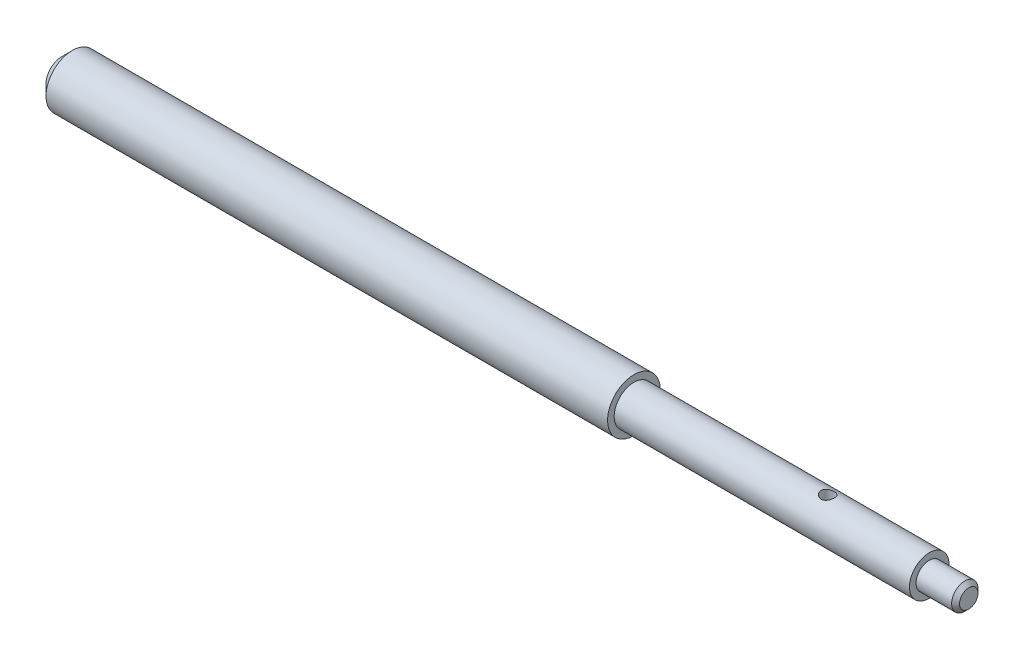
ISO-10303-21;
HEADER;
FILE_DESCRIPTION(('STEP AP214'),'2;1');
FILE_NAME('part.step','',(''),(''),'','','');
FILE_SCHEMA(('AUTOMOTIVE_DESIGN { 1 0 10303 214 1 1 1 1 }'));
ENDSEC;
DATA;
#1=APPLICATION_CONTEXT('core data for automotive mechanical design processes');
#2=APPLICATION_PROTOCOL_DEFINITION('international standard','automotive_design',2000,#1);
#3=PRODUCT_CONTEXT('',#1,'mechanical');
#4=PRODUCT('Part','Part','',(#3));
#5=PRODUCT_RELATED_PRODUCT_CATEGORY('part','',(#4));
#6=PRODUCT_DEFINITION_FORMATION('','',#4);
#7=PRODUCT_DEFINITION_CONTEXT('part definition',#1,'design');
#8=PRODUCT_DEFINITION('design','',#6,#7);
#9=PRODUCT_DEFINITION_SHAPE('','',#8);
#10=(LENGTH_UNIT() NAMED_UNIT(*) SI_UNIT(.MILLI.,.METRE.));
#11=(NAMED_UNIT(*) PLANE_ANGLE_UNIT() SI_UNIT($,.RADIAN.));
#12=(NAMED_UNIT(*) SI_UNIT($,.STERADIAN.) SOLID_ANGLE_UNIT());
#13=UNCERTAINTY_MEASURE_WITH_UNIT(LENGTH_MEASURE(1.E-05),#10,'distance_accuracy_value','');
#14=(GEOMETRIC_REPRESENTATION_CONTEXT(3) GLOBAL_UNCERTAINTY_ASSIGNED_CONTEXT((#13)) GLOBAL_UNIT_ASSIGNED_CONTEXT((#10,
#11,#12)) REPRESENTATION_CONTEXT('',''));
#15=CARTESIAN_POINT('',(0.,0.,0.));
#16=DIRECTION('',(0.,0.,1.));
#17=DIRECTION('',(1.,0.,0.));
#18=AXIS2_PLACEMENT_3D('',#15,#16,#17);
#19=CARTESIAN_POINT('',(303.948321010253,9.92894053429299,0.));
#20=DIRECTION('',(1.,0.,0.));
#21=DIRECTION('',(0.,0.,-1.));
#22=AXIS2_PLACEMENT_3D('',#19,#20,#21);
#23=PLANE('',#22);
#24=CARTESIAN_POINT('',(303.948321010239,7.428940534293,0.));
#25=DIRECTION('',(-1.,0.,0.));
#26=DIRECTION('',(0.,0.,1.));
#27=AXIS2_PLACEMENT_3D('',#24,#25,#26);
#28=CIRCLE('',#27,3.50000000004147);
#29=CARTESIAN_POINT('',(303.948321010239,7.428940534293,3.50000000004147));
#30=VERTEX_POINT('',#29);
#31=EDGE_CURVE('E21',#30,#30,#28,.T.);
#32=ORIENTED_EDGE('',*,*,#31,.F.);
#33=EDGE_LOOP('',(#32));
#34=FACE_BOUND('',#33,.T.);
#35=ADVANCED_FACE('F17',(#34),#23,.T.);
#36=CARTESIAN_POINT('',(302.448321010274,7.428940534293,0.));
#37=DIRECTION('',(-1.,0.,0.));
#38=DIRECTION('',(0.,0.,1.));
#39=AXIS2_PLACEMENT_3D('',#36,#37,#38);
#40=CONICAL_SURFACE('',#39,5.000000000006,0.785398163397448);
#41=CARTESIAN_POINT('',(302.448321010253,7.428940534293,0.));
#42=DIRECTION('',(1.,0.,0.));
#43=DIRECTION('',(0.,1.,0.));
#44=AXIS2_PLACEMENT_3D('',#41,#42,#43);
#45=CIRCLE('',#44,4.99999999999999);
#46=CARTESIAN_POINT('',(302.448321010253,12.428940534293,0.));
#47=VERTEX_POINT('',#46);
#48=EDGE_CURVE('E40',#47,#47,#45,.F.);
#49=ORIENTED_EDGE('',*,*,#48,.F.);
#50=EDGE_LOOP('',(#49));
#51=FACE_BOUND('',#50,.T.);
#52=ORIENTED_EDGE('',*,*,#31,.T.);
#53=EDGE_LOOP('',(#52));
#54=FACE_BOUND('',#53,.T.);
#55=ADVANCED_FACE('F33',(#51,#54),#40,.T.);
#56=CARTESIAN_POINT('',(-12.0516789897351,7.42894053429294,0.));
#57=DIRECTION('',(-1.,0.,0.));
#58=DIRECTION('',(0.,-1.,0.));
#59=AXIS2_PLACEMENT_3D('',#56,#57,#58);
#60=CONICAL_SURFACE('',#59,4.18799999994235,1.02974425867618);
#61=CARTESIAN_POINT('',(-9.53527471727966,7.42894053429294,0.));
#62=VERTEX_POINT('',#61);
#63=VERTEX_LOOP('',#62);
#64=FACE_BOUND('',#63,.T.);
#65=CARTESIAN_POINT('',(-12.0516789897468,7.42894053429294,0.));
#66=DIRECTION('',(-1.,0.,0.));
#67=DIRECTION('',(0.,-1.,0.));
#68=AXIS2_PLACEMENT_3D('',#65,#66,#67);
#69=CIRCLE('',#68,4.188);
#70=CARTESIAN_POINT('',(-12.0516789897468,3.24094053429295,0.));
#71=VERTEX_POINT('',#70);
#72=EDGE_CURVE('E37',#71,#71,#69,.T.);
#73=ORIENTED_EDGE('',*,*,#72,.T.);
#74=EDGE_LOOP('',(#73));
#75=FACE_BOUND('',#74,.T.);
#76=ADVANCED_FACE('F29',(#64,#75),#60,.F.);
#77=CARTESIAN_POINT('',(296.448321010253,7.42894053429299,0.));
#78=DIRECTION('',(1.,0.,0.));
#79=DIRECTION('',(0.,1.,0.));
#80=AXIS2_PLACEMENT_3D('',#77,#78,#79);
#81=CYLINDRICAL_SURFACE('',#80,4.99999999999999);
#82=ORIENTED_EDGE('',*,*,#48,.T.);
#83=EDGE_LOOP('',(#82));
#84=FACE_BOUND('',#83,.T.);
#85=CARTESIAN_POINT('',(288.948321010253,7.42894053429299,0.));
#86=DIRECTION('',(1.,0.,0.));
#87=DIRECTION('',(0.,1.,0.));
#88=AXIS2_PLACEMENT_3D('',#85,#86,#87);
#89=CIRCLE('',#88,4.99999999999999);
#90=CARTESIAN_POINT('',(288.948321010253,12.428940534293,0.));
#91=VERTEX_POINT('',#90);
#92=EDGE_CURVE('E39',#91,#91,#89,.F.);
#93=ORIENTED_EDGE('',*,*,#92,.F.);
#94=EDGE_LOOP('',(#93));
#95=FACE_BOUND('',#94,.T.);
#96=ADVANCED_FACE('F32',(#84,#95),#81,.T.);
#97=CARTESIAN_POINT('',(-26.0516789897468,7.42894053429294,0.));
#98=DIRECTION('',(-1.,0.,0.));
#99=DIRECTION('',(0.,-1.,0.));
#100=AXIS2_PLACEMENT_3D('',#97,#98,#99);
#101=CYLINDRICAL_SURFACE('',#100,4.188);
#102=CARTESIAN_POINT('',(-40.0516789897468,7.42894053429294,0.));
#103=DIRECTION('',(-1.,0.,0.));
#104=DIRECTION('',(0.,-1.,0.));
#105=AXIS2_PLACEMENT_3D('',#102,#103,#104);
#106=CIRCLE('',#105,4.188);
#107=CARTESIAN_POINT('',(-40.0516789897468,3.24094053429294,0.));
#108=VERTEX_POINT('',#107);
#109=EDGE_CURVE('E43',#108,#108,#106,.F.);
#110=ORIENTED_EDGE('',*,*,#109,.F.);
#111=EDGE_LOOP('',(#110));
#112=FACE_BOUND('',#111,.T.);
#113=ORIENTED_EDGE('',*,*,#72,.F.);
#114=EDGE_LOOP('',(#113));
#115=FACE_BOUND('',#114,.T.);
#116=ADVANCED_FACE('F84',(#112,#115),#101,.F.);
#117=CARTESIAN_POINT('',(288.948321010253,13.678940534293,0.));
#118=DIRECTION('',(1.,0.,0.));
#119=DIRECTION('',(0.,0.,-1.));
#120=AXIS2_PLACEMENT_3D('',#117,#118,#119);
#121=PLANE('',#120);
#122=CARTESIAN_POINT('',(288.948321010253,7.42894053429299,0.));
#123=DIRECTION('',(1.,0.,0.));
#124=DIRECTION('',(0.,1.,0.));
#125=AXIS2_PLACEMENT_3D('',#122,#123,#124);
#126=CIRCLE('',#125,7.5);
#127=CARTESIAN_POINT('',(288.948321010253,14.928940534293,0.));
#128=VERTEX_POINT('',#127);
#129=EDGE_CURVE('E61',#128,#128,#126,.F.);
#130=ORIENTED_EDGE('',*,*,#129,.F.);
#131=EDGE_LOOP('',(#130));
#132=FACE_BOUND('',#131,.T.);
#133=ORIENTED_EDGE('',*,*,#92,.T.);
#134=EDGE_LOOP('',(#133));
#135=FACE_BOUND('',#134,.T.);
#136=ADVANCED_FACE('F86',(#132,#135),#121,.T.);
#137=CARTESIAN_POINT('',(250.448321010253,-330.231891542581,0.));
#138=DIRECTION('',(0.,1.,0.));
#139=DIRECTION('',(0.,0.,1.));
#140=AXIS2_PLACEMENT_3D('',#137,#138,#139);
#141=CYLINDRICAL_SURFACE('',#140,2.5);
#142=CARTESIAN_POINT('',(252.948321010253,-0.0710594657070066,0.));
#143=CARTESIAN_POINT('',(252.948315289086,-0.0710553168671624,-0.136314653212454));
#144=CARTESIAN_POINT('',(252.937127317973,-0.0673054235412228,-0.272697015497234));
#145=CARTESIAN_POINT('',(252.892775388844,-0.0526992408798257,-0.541513676754403));
#146=CARTESIAN_POINT('',(252.859592311722,-0.0418367690802491,-0.673944436069899));
#147=CARTESIAN_POINT('',(252.772519291371,-0.0141908427939557,-0.93083838541186));
#148=CARTESIAN_POINT('',(252.718670425221,0.0025808606184202,-1.0553168132522));
#149=CARTESIAN_POINT('',(252.591957658,0.0403323388509107,-1.29345457608578));
#150=CARTESIAN_POINT('',(252.51909274861,0.0613123368005866,-1.40711333693402));
#151=CARTESIAN_POINT('',(252.353757299219,0.106087971569338,-1.62435286768726));
#152=CARTESIAN_POINT('',(252.260744755449,0.12995115727989,-1.72750715170701));
#153=CARTESIAN_POINT('',(252.058905279206,0.177432192263919,-1.9170800866657));
#154=CARTESIAN_POINT('',(251.950074562877,0.201049981383735,-2.00349472175254));
#155=CARTESIAN_POINT('',(251.71585817561,0.246107232723915,-2.15956236853007));
#156=CARTESIAN_POINT('',(251.590086569022,0.267464568412221,-2.22866219130383));
#157=CARTESIAN_POINT('',(251.327880676565,0.304557909711179,-2.34454722267796));
#158=CARTESIAN_POINT('',(251.191449667114,0.320295634421334,-2.39133925694144));
#159=CARTESIAN_POINT('',(250.916637989899,0.343657949839375,-2.45968364452053));
#160=CARTESIAN_POINT('',(250.778478057837,0.351538136224064,-2.48203360995672));
#161=CARTESIAN_POINT('',(250.50016169452,0.359049118644279,-2.50335280844789));
#162=CARTESIAN_POINT('',(250.360005892559,0.358682459754604,-2.5023292548481));
#163=CARTESIAN_POINT('',(250.088479715616,0.349965168186405,-2.47754978711554));
#164=CARTESIAN_POINT('',(249.957000562013,0.341980171664286,-2.45483488748614));
#165=CARTESIAN_POINT('',(249.699837996523,0.319524152884575,-2.38901558266189));
#166=CARTESIAN_POINT('',(249.574155305244,0.305052326576364,-2.34590864981248));
#167=CARTESIAN_POINT('',(249.329785848802,0.270992296947017,-2.2398462476676));
#168=CARTESIAN_POINT('',(249.211244617322,0.251325336049249,-2.17658185417499));
#169=CARTESIAN_POINT('',(248.986138019905,0.209125364104765,-2.03221830577523));
#170=CARTESIAN_POINT('',(248.879575484144,0.186591678413515,-1.95111494942618));
#171=CARTESIAN_POINT('',(248.675609928247,0.139761406617017,-1.76838980557481));
#172=CARTESIAN_POINT('',(248.578972480831,0.11543411332981,-1.66591968733747));
#173=CARTESIAN_POINT('',(248.404019566381,0.0687747460619948,-1.44588748626492));
#174=CARTESIAN_POINT('',(248.325712130403,0.0464435492839721,-1.32831882300372));
#175=CARTESIAN_POINT('',(248.189021881702,0.00599537469104058,-1.07976849629978));
#176=CARTESIAN_POINT('',(248.130859338821,-0.012074364585716,-0.948657728384027));
#177=CARTESIAN_POINT('',(248.037750903227,-0.0415932671800559,-0.677907908939383));
#178=CARTESIAN_POINT('',(248.002757477839,-0.0530559788679125,-0.538286963583211));
#179=CARTESIAN_POINT('',(247.969457131976,-0.0640354472506519,-0.331144714284248));
#180=CARTESIAN_POINT('',(247.961540987829,-0.0666615245410833,-0.265203309002763));
#181=CARTESIAN_POINT('',(247.950971052392,-0.0701748653833046,-0.132852390134966));
#182=CARTESIAN_POINT('',(247.948317276651,-0.0710621237973576,-0.0664428751660984));
#183=CARTESIAN_POINT('',(247.94832866473,-0.0710540161992309,0.136218456610964));
#184=CARTESIAN_POINT('',(247.959506234404,-0.0673081125267976,0.272577131195229));
#185=CARTESIAN_POINT('',(248.003839760976,-0.052708192622139,0.541419482910542));
#186=CARTESIAN_POINT('',(248.037032281082,-0.0418423517082799,0.673896330118084));
#187=CARTESIAN_POINT('',(248.124127154109,-0.0141893886807071,0.930848136584548));
#188=CARTESIAN_POINT('',(248.177982221765,0.00258420668086991,1.05534061399224));
#189=CARTESIAN_POINT('',(248.304698779855,0.0403364545026818,1.29347783804415));
#190=CARTESIAN_POINT('',(248.377557533634,0.0613145013936149,1.40712414339235));
#191=CARTESIAN_POINT('',(248.542875932665,0.106085666564891,1.62434137046777));
#192=CARTESIAN_POINT('',(248.635877389843,0.129946312937663,1.72748595674383));
#193=CARTESIAN_POINT('',(248.837715434827,0.177427348219232,1.9170626035233));
#194=CARTESIAN_POINT('',(248.946559019678,0.201047626005807,2.00348723977977));
#195=CARTESIAN_POINT('',(249.180836469829,0.246118109871319,2.1595993481913));
#196=CARTESIAN_POINT('',(249.306661192686,0.267485078448849,2.22872605232901));
#197=CARTESIAN_POINT('',(249.568903897811,0.304572536494688,2.34459310944108));
#198=CARTESIAN_POINT('',(249.705308454272,0.320300044334159,2.39136131215655));
#199=CARTESIAN_POINT('',(249.943325026568,0.340543637268385,2.45056654982395));
#200=CARTESIAN_POINT('',(250.043304470877,0.346999488540521,2.4690650550467));
#201=CARTESIAN_POINT('',(250.244950364944,0.355665757458104,2.49378342479918));
#202=CARTESIAN_POINT('',(250.346616659674,0.357876563086767,2.50000441145518));
#203=CARTESIAN_POINT('',(250.584398806186,0.357867583724572,2.49999409758682));
#204=CARTESIAN_POINT('',(250.720544728747,0.353897840760277,2.48884364355159));
#205=CARTESIAN_POINT('',(250.98886910805,0.338511194600065,2.44465430727942));
#206=CARTESIAN_POINT('',(251.121043831329,0.327087499548411,2.41159546223126));
#207=CARTESIAN_POINT('',(251.377395710493,0.298233880141883,2.32488474859167));
#208=CARTESIAN_POINT('',(251.501590161584,0.280817502936045,2.27127929709113));
#209=CARTESIAN_POINT('',(251.739240303293,0.241959120286362,2.14514239230618));
#210=CARTESIAN_POINT('',(251.852695356798,0.220516876233949,2.07260981713322));
#211=CARTESIAN_POINT('',(252.07011017728,0.175080457988287,1.9076360242075));
#212=CARTESIAN_POINT('',(252.173589793703,0.151022707810207,1.81457938637959));
#213=CARTESIAN_POINT('',(252.363821697657,0.103598371029165,1.61248899085973));
#214=CARTESIAN_POINT('',(252.450568124143,0.0802320290193482,1.50344965844521));
#215=CARTESIAN_POINT('',(252.607054589742,0.0360834555833934,1.26895960829725));
#216=CARTESIAN_POINT('',(252.676283707275,0.0153859943818158,1.1431508893244));
#217=CARTESIAN_POINT('',(252.792345109072,-0.0203129831486394,0.880938249759293));
#218=CARTESIAN_POINT('',(252.839204060768,-0.0353212771029282,0.744547171109409));
#219=CARTESIAN_POINT('',(252.898630669646,-0.0546080078502747,0.506299715267376));
#220=CARTESIAN_POINT('',(252.917226269063,-0.0607428046505633,0.406056322361769));
#221=CARTESIAN_POINT('',(252.942073117373,-0.0689699340427822,0.203887829763278));
#222=CARTESIAN_POINT('',(252.948325289665,-0.0710625690238654,0.101962856442724));
#223=CARTESIAN_POINT('',(252.948321010253,-0.0710594657070066,0.));
#224=B_SPLINE_CURVE_WITH_KNOTS('',3,(#142,#143,#144,#145,#146,#147,#148,#149,#150,#151,#152,
#153,#154,#155,#156,#157,#158,#159,#160,#161,#162,#163,#164,#165,#166,#167,#168,#169,#170,#171,
#172,#173,#174,#175,#176,#177,#178,#179,#180,#181,#182,#183,#184,#185,#186,#187,#188,#189,#190,
#191,#192,#193,#194,#195,#196,#197,#198,#199,#200,#201,#202,#203,#204,#205,#206,#207,#208,#209,
#210,#211,#212,#213,#214,#215,#216,#217,#218,#219,#220,#221,#222,#223),.UNSPECIFIED.,.T.,.F.,(4,
2,2,2,2,2,2,2,2,2,2,2,2,2,2,2,2,2,2,2,2,2,2,2,2,2,2,2,2,2,2,2,2,2,2,2,2,2,2,2,4),(0.,
0.408561184101175,0.817477973983801,1.22558614097199,1.63371595213867,2.05461297159067,
2.47561083978723,2.90870978404819,3.34167612494509,3.76004804752214,4.17829085730669,
4.57741982509669,4.97659827910506,5.38221510814131,5.78792757075361,6.21475977977318,
6.64177865120549,7.07332926814206,7.50399176993688,7.70319475724399,7.90239833314088,
8.3107973314116,8.71987631739354,9.12802467609565,9.53611429117232,9.95696851109597,
10.3780091783553,10.8113124048922,11.2440744937057,11.5489281217545,11.8537538858575,
12.261602890213,12.6698240363626,13.0771283494235,13.4844568105745,13.9062474314535,
14.3281855234508,14.7612919783175,15.1938808304878,15.4995059494554,15.8051082040982),.UNSPECIFIED.);
#225=CARTESIAN_POINT('',(252.948321010253,-0.0710594657070066,0.));
#226=VERTEX_POINT('',#225);
#227=EDGE_CURVE('E54',#226,#226,#224,.T.);
#228=ORIENTED_EDGE('',*,*,#227,.F.);
#229=EDGE_LOOP('',(#228));
#230=FACE_BOUND('',#229,.T.);
#231=CARTESIAN_POINT('',(247.948321010253,14.928940534293,0.));
#232=CARTESIAN_POINT('',(247.948328665469,14.9289350848328,-0.136218406325859));
#233=CARTESIAN_POINT('',(247.959506230262,14.9251891841306,-0.27257703051411));
#234=CARTESIAN_POINT('',(248.003839732321,14.9105892689994,-0.541419384923745));
#235=CARTESIAN_POINT('',(248.037032248957,14.8997234246524,-0.6738962822006));
#236=CARTESIAN_POINT('',(248.12412669616,14.8720706084957,-0.930846738765846));
#237=CARTESIAN_POINT('',(248.177981107955,14.8552972301949,-1.05533790266234));
#238=CARTESIAN_POINT('',(248.304697122312,14.817545071522,-1.29347534144741));
#239=CARTESIAN_POINT('',(248.377556402661,14.7965668050194,-1.40712293900033));
#240=CARTESIAN_POINT('',(248.542883350477,14.7517934637527,-1.62435082651193));
#241=CARTESIAN_POINT('',(248.635894219424,14.7279306913487,-1.72750371232063));
#242=CARTESIAN_POINT('',(248.837733180245,14.6804496505605,-1.91707732111446));
#243=CARTESIAN_POINT('',(248.946565571225,14.6568314505073,-2.00349348137674));
#244=CARTESIAN_POINT('',(249.180784076486,14.6117737908894,-2.1595625057599));
#245=CARTESIAN_POINT('',(249.306555937185,14.5904164177381,-2.22866245329346));
#246=CARTESIAN_POINT('',(249.568761868614,14.5533230982708,-2.34454740728067));
#247=CARTESIAN_POINT('',(249.705192621853,14.537585411303,-2.39133932497118));
#248=CARTESIAN_POINT('',(249.980004057473,14.5142231165005,-2.45968364998002));
#249=CARTESIAN_POINT('',(250.118164018147,14.5063429292407,-2.48203361856386));
#250=CARTESIAN_POINT('',(250.396480382413,14.4988319500405,-2.50335280841647));
#251=CARTESIAN_POINT('',(250.536636155896,14.4991986097229,-2.50232925239061));
#252=CARTESIAN_POINT('',(250.808162276272,14.5079158994863,-2.47754978963836));
#253=CARTESIAN_POINT('',(250.939641401772,14.5159008934519,-2.45483489729083));
#254=CARTESIAN_POINT('',(251.196803969764,14.5383569094768,-2.38901560125363));
#255=CARTESIAN_POINT('',(251.322486689148,14.5528287383749,-2.34590866114437));
#256=CARTESIAN_POINT('',(251.56685617877,14.5868887726185,-2.23984624460371));
#257=CARTESIAN_POINT('',(251.68539741672,14.6065557347839,-2.17658184694414));
#258=CARTESIAN_POINT('',(251.910504012746,14.6487557070494,-2.03221829653572));
#259=CARTESIAN_POINT('',(252.01706654201,14.6712893914685,-1.95111494437169));
#260=CARTESIAN_POINT('',(252.221032102803,14.7181196643902,-1.76838979612485));
#261=CARTESIAN_POINT('',(252.317669559201,14.7424469601724,-1.66591966662865));
#262=CARTESIAN_POINT('',(252.492622469977,14.7891063270441,-1.44588746247997));
#263=CARTESIAN_POINT('',(252.570929897,14.8114375213353,-1.32831881043453));
#264=CARTESIAN_POINT('',(252.70762011606,14.851885687172,-1.07976853768725));
#265=CARTESIAN_POINT('',(252.765782643141,14.8699554212274,-0.94865781537903));
#266=CARTESIAN_POINT('',(252.858891093993,14.8994743281069,-0.677908001637243));
#267=CARTESIAN_POINT('',(252.893884535176,14.9109370449508,-0.538287010567742));
#268=CARTESIAN_POINT('',(252.927184894438,14.9219165177998,-0.331144677356544));
#269=CARTESIAN_POINT('',(252.935101041503,14.9245425960933,-0.265203234675866));
#270=CARTESIAN_POINT('',(252.945670971203,14.9280559349632,-0.132852315286589));
#271=CARTESIAN_POINT('',(252.948324744214,14.9289431923596,-0.0664428377222344));
#272=CARTESIAN_POINT('',(252.948313355038,14.9289350848328,0.136218406325849));
#273=CARTESIAN_POINT('',(252.937135790244,14.9251891841306,0.272577030514102));
#274=CARTESIAN_POINT('',(252.892802288185,14.9105892689994,0.541419384923739));
#275=CARTESIAN_POINT('',(252.85960977155,14.8997234246524,0.673896282200594));
#276=CARTESIAN_POINT('',(252.772515324346,14.8720706084957,0.930846738765848));
#277=CARTESIAN_POINT('',(252.718660912551,14.8552972301949,1.05533790266235));
#278=CARTESIAN_POINT('',(252.591944898194,14.817545071522,1.29347534144742));
#279=CARTESIAN_POINT('',(252.519085617845,14.7965668050194,1.40712293900034));
#280=CARTESIAN_POINT('',(252.353758670029,14.7517934637527,1.62435082651192));
#281=CARTESIAN_POINT('',(252.260747801083,14.7279306913487,1.72750371232061));
#282=CARTESIAN_POINT('',(252.058908840262,14.6804496505605,1.91707732111444));
#283=CARTESIAN_POINT('',(251.950076449282,14.6568314505073,2.00349348137674));
#284=CARTESIAN_POINT('',(251.71585794402,14.6117737908894,2.15956250575989));
#285=CARTESIAN_POINT('',(251.590086083321,14.5904164177381,2.22866245329343));
#286=CARTESIAN_POINT('',(251.327880151892,14.5533230982708,2.34454740728063));
#287=CARTESIAN_POINT('',(251.191449398653,14.537585411303,2.39133932497116));
#288=CARTESIAN_POINT('',(250.916637963033,14.5142231165005,2.45968364998));
#289=CARTESIAN_POINT('',(250.778478002359,14.5063429292407,2.48203361856384));
#290=CARTESIAN_POINT('',(250.500161638093,14.4988319500405,2.50335280841646));
#291=CARTESIAN_POINT('',(250.36000586461,14.4991986097229,2.5023292523906));
#292=CARTESIAN_POINT('',(250.088479744234,14.5079158994863,2.47754978963835));
#293=CARTESIAN_POINT('',(249.957000618735,14.5159008934519,2.45483489729083));
#294=CARTESIAN_POINT('',(249.699838050743,14.5383569094768,2.38901560125363));
#295=CARTESIAN_POINT('',(249.574155331358,14.5528287383749,2.34590866114436));
#296=CARTESIAN_POINT('',(249.329785841736,14.5868887726185,2.23984624460369));
#297=CARTESIAN_POINT('',(249.211244603786,14.6065557347839,2.17658184694414));
#298=CARTESIAN_POINT('',(248.98613800776,14.6487557070494,2.03221829653571));
#299=CARTESIAN_POINT('',(248.879575478497,14.6712893914685,1.95111494437167));
#300=CARTESIAN_POINT('',(248.675609917704,14.7181196643902,1.76838979612479));
#301=CARTESIAN_POINT('',(248.578972461305,14.7424469601724,1.66591966662858));
#302=CARTESIAN_POINT('',(248.404019550529,14.7891063270441,1.44588746247989));
#303=CARTESIAN_POINT('',(248.325712123507,14.8114375213353,1.32831881043447));
#304=CARTESIAN_POINT('',(248.189021904447,14.851885687172,1.07976853768721));
#305=CARTESIAN_POINT('',(248.130859377366,14.8699554212274,0.948657815378977));
#306=CARTESIAN_POINT('',(248.037750926514,14.8994743281069,0.677908001637187));
#307=CARTESIAN_POINT('',(248.00275748533,14.9109370449508,0.538287010567692));
#308=CARTESIAN_POINT('',(247.969457126068,14.9219165177998,0.331144677356504));
#309=CARTESIAN_POINT('',(247.961540979003,14.9245425960933,0.265203234675831));
#310=CARTESIAN_POINT('',(247.950971049303,14.9280559349632,0.132852315286564));
#311=CARTESIAN_POINT('',(247.948317276292,14.9289431923596,0.0664428377222157));
#312=CARTESIAN_POINT('',(247.948321010253,14.928940534293,0.));
#313=B_SPLINE_CURVE_WITH_KNOTS('',3,(#231,#232,#233,#234,#235,#236,#237,#238,#239,#240,#241,
#242,#243,#244,#245,#246,#247,#248,#249,#250,#251,#252,#253,#254,#255,#256,#257,#258,#259,#260,
#261,#262,#263,#264,#265,#266,#267,#268,#269,#270,#271,#272,#273,#274,#275,#276,#277,#278,#279,
#280,#281,#282,#283,#284,#285,#286,#287,#288,#289,#290,#291,#292,#293,#294,#295,#296,#297,#298,
#299,#300,#301,#302,#303,#304,#305,#306,#307,#308,#309,#310,#311,#312),.UNSPECIFIED.,.T.,.F.,(4,
2,2,2,2,2,2,2,2,2,2,2,2,2,2,2,2,2,2,2,2,2,2,2,2,2,2,2,2,2,2,2,2,2,2,2,2,2,2,2,4),(0.,
0.408398847766772,0.817477984261935,1.2256218953619,1.6337159585278,2.05460611183079,
2.47561084610549,2.90871062160143,3.34167613139053,3.76004813773519,4.17829086375591,
4.57741974575073,4.97659828556394,5.382215137665,5.78792757721047,6.2147598292476,
6.64177865766522,7.07332913204429,7.50399177637986,7.7031948758234,7.90239833958438,
8.31079718735116,8.71987632384633,9.12802023494633,9.5361142981122,9.95700445141515,
10.3780091856899,10.8111089611858,11.2440744709748,11.6624464773195,12.0806892033403,
12.4798180853351,12.8789966251483,13.2846134772494,13.6903259167949,14.1171581688321,
14.5441769972496,14.9757274716287,15.4063901159643,15.6055932154078,15.8047966791688),.UNSPECIFIED.);
#314=CARTESIAN_POINT('',(247.948321010253,14.928940534293,0.));
#315=VERTEX_POINT('',#314);
#316=EDGE_CURVE('E75',#315,#315,#313,.T.);
#317=ORIENTED_EDGE('',*,*,#316,.F.);
#318=EDGE_LOOP('',(#317));
#319=FACE_BOUND('',#318,.T.);
#320=ADVANCED_FACE('F63',(#230,#319),#141,.F.);
#321=CARTESIAN_POINT('',(-40.0516789897468,12.4289405342929,0.));
#322=DIRECTION('',(-1.,0.,0.));
#323=DIRECTION('',(0.,-1.,0.));
#324=AXIS2_PLACEMENT_3D('',#321,#322,#323);
#325=PLANE('',#324);
#326=CARTESIAN_POINT('',(-40.0516789897441,7.42894053429294,0.));
#327=DIRECTION('',(1.,0.,0.));
#328=DIRECTION('',(0.,0.,-1.));
#329=AXIS2_PLACEMENT_3D('',#326,#327,#328);
#330=CIRCLE('',#329,5.9999999999973);
#331=CARTESIAN_POINT('',(-40.0516789897441,7.42894053429294,-5.9999999999973));
#332=VERTEX_POINT('',#331);
#333=EDGE_CURVE('E51',#332,#332,#330,.T.);
#334=ORIENTED_EDGE('',*,*,#333,.F.);
#335=EDGE_LOOP('',(#334));
#336=FACE_BOUND('',#335,.T.);
#337=ORIENTED_EDGE('',*,*,#109,.T.);
#338=EDGE_LOOP('',(#337));
#339=FACE_BOUND('',#338,.T.);
#340=ADVANCED_FACE('F72',(#336,#339),#325,.T.);
#341=CARTESIAN_POINT('',(232.948321010253,7.42894053429298,0.));
#342=DIRECTION('',(1.,0.,0.));
#343=DIRECTION('',(0.,1.,0.));
#344=AXIS2_PLACEMENT_3D('',#341,#342,#343);
#345=CYLINDRICAL_SURFACE('',#344,7.5);
#346=ORIENTED_EDGE('',*,*,#316,.T.);
#347=EDGE_LOOP('',(#346));
#348=FACE_BOUND('',#347,.T.);
#349=ORIENTED_EDGE('',*,*,#129,.T.);
#350=EDGE_LOOP('',(#349));
#351=FACE_BOUND('',#350,.T.);
#352=ORIENTED_EDGE('',*,*,#227,.T.);
#353=EDGE_LOOP('',(#352));
#354=FACE_BOUND('',#353,.T.);
#355=CARTESIAN_POINT('',(176.948321010253,7.42894053429298,0.));
#356=DIRECTION('',(1.,0.,0.));
#357=DIRECTION('',(0.,1.,0.));
#358=AXIS2_PLACEMENT_3D('',#355,#356,#357);
#359=CIRCLE('',#358,7.5);
#360=CARTESIAN_POINT('',(176.948321010253,14.928940534293,0.));
#361=VERTEX_POINT('',#360);
#362=EDGE_CURVE('E48',#361,#361,#359,.F.);
#363=ORIENTED_EDGE('',*,*,#362,.F.);
#364=EDGE_LOOP('',(#363));
#365=FACE_BOUND('',#364,.T.);
#366=ADVANCED_FACE('F67',(#348,#351,#354,#365),#345,.T.);
#367=CARTESIAN_POINT('',(-36.0516789897278,7.42894053429294,0.));
#368=DIRECTION('',(1.,0.,0.));
#369=DIRECTION('',(0.,0.,-1.));
#370=AXIS2_PLACEMENT_3D('',#367,#368,#369);
#371=CONICAL_SURFACE('',#370,9.99999999999547,0.78539816339519);
#372=CARTESIAN_POINT('',(-36.0516789897468,7.42894053429294,0.));
#373=DIRECTION('',(1.,0.,0.));
#374=DIRECTION('',(0.,1.,0.));
#375=AXIS2_PLACEMENT_3D('',#372,#373,#374);
#376=CIRCLE('',#375,9.99999999999999);
#377=CARTESIAN_POINT('',(-36.0516789897468,17.4289405342929,0.));
#378=VERTEX_POINT('',#377);
#379=EDGE_CURVE('E25',#378,#378,#376,.T.);
#380=ORIENTED_EDGE('',*,*,#379,.F.);
#381=EDGE_LOOP('',(#380));
#382=FACE_BOUND('',#381,.T.);
#383=ORIENTED_EDGE('',*,*,#333,.T.);
#384=EDGE_LOOP('',(#383));
#385=FACE_BOUND('',#384,.T.);
#386=ADVANCED_FACE('F71',(#382,#385),#371,.T.);
#387=CARTESIAN_POINT('',(176.948321010253,16.178940534293,0.));
#388=DIRECTION('',(1.,0.,0.));
#389=DIRECTION('',(0.,0.,-1.));
#390=AXIS2_PLACEMENT_3D('',#387,#388,#389);
#391=PLANE('',#390);
#392=CARTESIAN_POINT('',(176.948321010253,7.42894053429298,0.));
#393=DIRECTION('',(1.,0.,0.));
#394=DIRECTION('',(0.,1.,0.));
#395=AXIS2_PLACEMENT_3D('',#392,#393,#394);
#396=CIRCLE('',#395,9.99999999999999);
#397=CARTESIAN_POINT('',(176.948321010253,17.428940534293,0.));
#398=VERTEX_POINT('',#397);
#399=EDGE_CURVE('E11',#398,#398,#396,.F.);
#400=ORIENTED_EDGE('',*,*,#399,.F.);
#401=EDGE_LOOP('',(#400));
#402=FACE_BOUND('',#401,.T.);
#403=ORIENTED_EDGE('',*,*,#362,.T.);
#404=EDGE_LOOP('',(#403));
#405=FACE_BOUND('',#404,.T.);
#406=ADVANCED_FACE('F97',(#402,#405),#391,.T.);
#407=CARTESIAN_POINT('',(68.4483210102532,7.42894053429296,0.));
#408=DIRECTION('',(1.,0.,0.));
#409=DIRECTION('',(0.,1.,0.));
#410=AXIS2_PLACEMENT_3D('',#407,#408,#409);
#411=CYLINDRICAL_SURFACE('',#410,9.99999999999999);
#412=ORIENTED_EDGE('',*,*,#379,.T.);
#413=EDGE_LOOP('',(#412));
#414=FACE_BOUND('',#413,.T.);
#415=ORIENTED_EDGE('',*,*,#399,.T.);
#416=EDGE_LOOP('',(#415));
#417=FACE_BOUND('',#416,.T.);
#418=ADVANCED_FACE('F19',(#414,#417),#411,.T.);
#419=CLOSED_SHELL('',(#35,#55,#76,#96,#116,#136,#320,#340,#366,#386,#406,#418));
#420=MANIFOLD_SOLID_BREP('B1',#419);
#421=ADVANCED_BREP_SHAPE_REPRESENTATION('',(#18,#420),#14);
#422=SHAPE_DEFINITION_REPRESENTATION(#9,#421);
ENDSEC;
END-ISO-10303-21;
